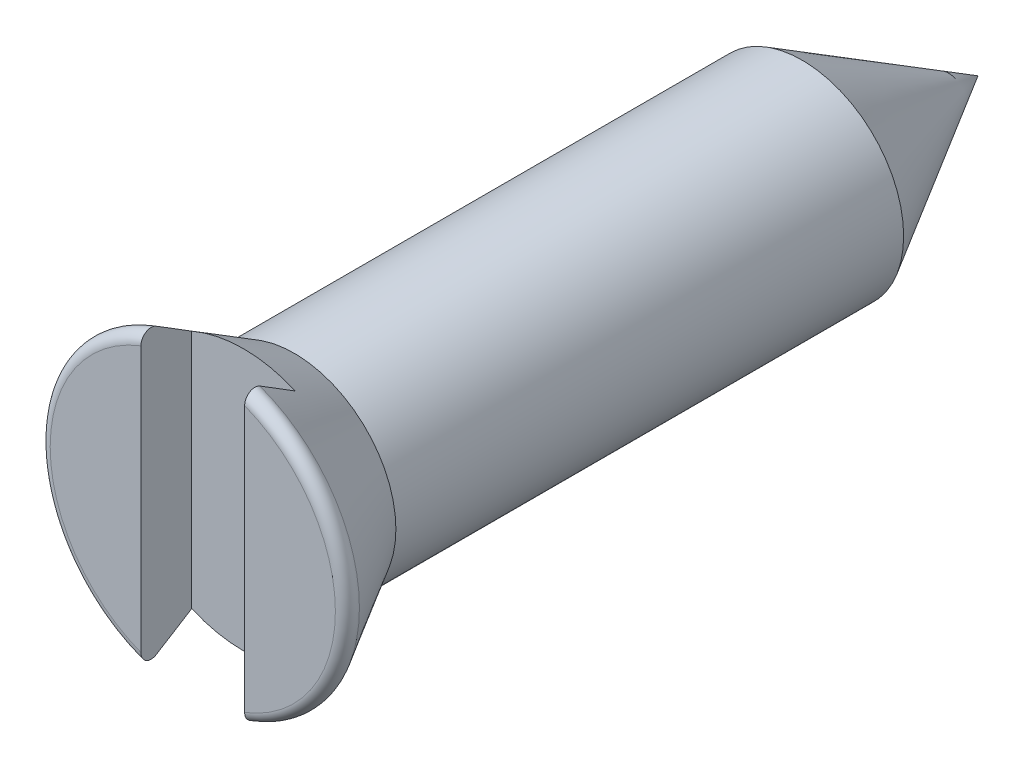
ISO-10303-21;
HEADER;
FILE_DESCRIPTION(('STEP AP214'),'2;1');
FILE_NAME('part.step','',(''),(''),'','','');
FILE_SCHEMA(('AUTOMOTIVE_DESIGN { 1 0 10303 214 1 1 1 1 }'));
ENDSEC;
DATA;
#1=APPLICATION_CONTEXT('core data for automotive mechanical design processes');
#2=APPLICATION_PROTOCOL_DEFINITION('international standard','automotive_design',2000,#1);
#3=PRODUCT_CONTEXT('',#1,'mechanical');
#4=PRODUCT('Part','Part','',(#3));
#5=PRODUCT_RELATED_PRODUCT_CATEGORY('part','',(#4));
#6=PRODUCT_DEFINITION_FORMATION('','',#4);
#7=PRODUCT_DEFINITION_CONTEXT('part definition',#1,'design');
#8=PRODUCT_DEFINITION('design','',#6,#7);
#9=PRODUCT_DEFINITION_SHAPE('','',#8);
#10=(LENGTH_UNIT() NAMED_UNIT(*) SI_UNIT(.MILLI.,.METRE.));
#11=(NAMED_UNIT(*) PLANE_ANGLE_UNIT() SI_UNIT($,.RADIAN.));
#12=(NAMED_UNIT(*) SI_UNIT($,.STERADIAN.) SOLID_ANGLE_UNIT());
#13=UNCERTAINTY_MEASURE_WITH_UNIT(LENGTH_MEASURE(1.E-05),#10,'distance_accuracy_value','');
#14=(GEOMETRIC_REPRESENTATION_CONTEXT(3) GLOBAL_UNCERTAINTY_ASSIGNED_CONTEXT((#13)) GLOBAL_UNIT_ASSIGNED_CONTEXT((#10,
#11,#12)) REPRESENTATION_CONTEXT('',''));
#15=CARTESIAN_POINT('',(0.,0.,0.));
#16=DIRECTION('',(0.,0.,1.));
#17=DIRECTION('',(1.,0.,0.));
#18=AXIS2_PLACEMENT_3D('',#15,#16,#17);
#19=CARTESIAN_POINT('',(0.,0.,5.99999999999999));
#20=DIRECTION('',(0.,0.,1.));
#21=DIRECTION('',(1.,0.,0.));
#22=AXIS2_PLACEMENT_3D('',#19,#20,#21);
#23=PLANE('',#22);
#24=DIRECTION('',(0.,1.,0.));
#25=VECTOR('',#24,1.);
#26=CARTESIAN_POINT('',(0.510620476138833,-1.49241435300667,5.99999999999999));
#27=LINE('',#26,#25);
#28=CARTESIAN_POINT('',(0.510620476138833,-1.30801010682125,5.99999999999999));
#29=VERTEX_POINT('',#28);
#30=CARTESIAN_POINT('',(0.510620476138833,1.30801010682125,5.99999999999999));
#31=VERTEX_POINT('',#30);
#32=EDGE_CURVE('E134',#29,#31,#27,.T.);
#33=ORIENTED_EDGE('',*,*,#32,.F.);
#34=CARTESIAN_POINT('',(0.,0.,5.99999999999999));
#35=DIRECTION('',(0.,0.,1.));
#36=DIRECTION('',(1.,0.,0.));
#37=AXIS2_PLACEMENT_3D('',#34,#35,#36);
#38=CIRCLE('',#37,1.40414518843273);
#39=EDGE_CURVE('E226',#29,#31,#38,.T.);
#40=ORIENTED_EDGE('',*,*,#39,.T.);
#41=EDGE_LOOP('',(#33,#40));
#42=FACE_BOUND('',#41,.T.);
#43=ADVANCED_FACE('F39',(#42),#23,.T.);
#44=CARTESIAN_POINT('',(0.,0.,5.));
#45=DIRECTION('',(0.,0.,-1.));
#46=DIRECTION('',(-1.,0.,0.));
#47=AXIS2_PLACEMENT_3D('',#44,#45,#46);
#48=CYLINDRICAL_SURFACE('',#47,1.);
#49=CARTESIAN_POINT('',(0.,0.,5.));
#50=DIRECTION('',(0.,0.,1.));
#51=DIRECTION('',(1.,0.,0.));
#52=AXIS2_PLACEMENT_3D('',#49,#50,#51);
#53=CIRCLE('',#52,1.);
#54=CARTESIAN_POINT('',(1.,0.,5.));
#55=VERTEX_POINT('',#54);
#56=EDGE_CURVE('E214',#55,#55,#53,.T.);
#57=ORIENTED_EDGE('',*,*,#56,.F.);
#58=EDGE_LOOP('',(#57));
#59=FACE_BOUND('',#58,.T.);
#60=CARTESIAN_POINT('',(0.,0.,0.));
#61=DIRECTION('',(0.,0.,1.));
#62=DIRECTION('',(1.,0.,0.));
#63=AXIS2_PLACEMENT_3D('',#60,#61,#62);
#64=CIRCLE('',#63,1.);
#65=CARTESIAN_POINT('',(1.,0.,0.));
#66=VERTEX_POINT('',#65);
#67=EDGE_CURVE('E217',#66,#66,#64,.T.);
#68=ORIENTED_EDGE('',*,*,#67,.T.);
#69=EDGE_LOOP('',(#68));
#70=FACE_BOUND('',#69,.T.);
#71=ADVANCED_FACE('F187',(#59,#70),#48,.T.);
#72=CARTESIAN_POINT('',(0.,0.,0.));
#73=DIRECTION('',(0.,0.,1.));
#74=DIRECTION('',(1.,0.,0.));
#75=AXIS2_PLACEMENT_3D('',#72,#73,#74);
#76=CONICAL_SURFACE('',#75,1.,0.5235987755983);
#77=CARTESIAN_POINT('',(0.,0.,-1.73205080756887));
#78=VERTEX_POINT('',#77);
#79=VERTEX_LOOP('',#78);
#80=FACE_BOUND('',#79,.T.);
#81=ORIENTED_EDGE('',*,*,#67,.F.);
#82=EDGE_LOOP('',(#81));
#83=FACE_BOUND('',#82,.T.);
#84=ADVANCED_FACE('F190',(#80,#83),#76,.T.);
#85=CARTESIAN_POINT('',(0.,0.,5.));
#86=DIRECTION('',(0.,0.,1.));
#87=DIRECTION('',(1.,0.,0.));
#88=AXIS2_PLACEMENT_3D('',#85,#86,#87);
#89=CONICAL_SURFACE('',#88,1.,0.5235987755983);
#90=CARTESIAN_POINT('',(-0.510620476138839,2.57572159850968,7.81605045241254));
#91=CARTESIAN_POINT('',(-0.510620476138839,2.5034979438429,7.69335233906957));
#92=CARTESIAN_POINT('',(-0.510620476138839,2.43119633814641,7.5706999564356));
#93=CARTESIAN_POINT('',(-0.510620476138839,2.28636656515141,7.32552129792128));
#94=CARTESIAN_POINT('',(-0.510620476138839,2.21383838738898,7.20299502822338));
#95=CARTESIAN_POINT('',(-0.510620476138839,2.06835790538867,6.95788955493391));
#96=CARTESIAN_POINT('',(-0.510620476138839,1.99540506642551,6.8353106684754));
#97=CARTESIAN_POINT('',(-0.510620476138839,1.84910103434979,6.59039763558222));
#98=CARTESIAN_POINT('',(-0.510620476138839,1.77574985782723,6.46806347924101));
#99=CARTESIAN_POINT('',(-0.510620476138839,1.62497597607226,6.21792463689314));
#100=CARTESIAN_POINT('',(-0.510620476138839,1.54752559601406,6.09013659303197));
#101=CARTESIAN_POINT('',(-0.510620476138839,1.39166129346604,5.83512705601668));
#102=CARTESIAN_POINT('',(-0.510620476138839,1.31324725039086,5.70790563653593));
#103=CARTESIAN_POINT('',(-0.510620476138839,1.15496581042367,5.45454941081888));
#104=CARTESIAN_POINT('',(-0.510620476138838,1.07510004793244,5.32841359282557));
#105=CARTESIAN_POINT('',(-0.510620476138838,0.953177285371248,5.14060405509319));
#106=CARTESIAN_POINT('',(-0.510620476138838,0.912186635710702,5.07823953327371));
#107=CARTESIAN_POINT('',(-0.510620476138838,0.829174451924031,4.95420208113852));
#108=CARTESIAN_POINT('',(-0.510620476138838,0.787152992721917,4.89252910103035));
#109=CARTESIAN_POINT('',(-0.510620476138838,0.71473401408326,4.78909967861266));
#110=CARTESIAN_POINT('',(-0.510620476138838,0.684742684002507,4.7470595377968));
#111=CARTESIAN_POINT('',(-0.510620476138838,0.623701761149009,4.66370925060968));
#112=CARTESIAN_POINT('',(-0.510620476138838,0.592651544456822,4.62239955718532));
#113=CARTESIAN_POINT('',(-0.510620476138838,0.529110956920073,4.54101715932744));
#114=CARTESIAN_POINT('',(-0.510620476138838,0.496623267892172,4.50094236991849));
#115=CARTESIAN_POINT('',(-0.510620476138838,0.429416871613894,4.42272701134252));
#116=CARTESIAN_POINT('',(-0.510620476138838,0.394700779174009,4.38458426588876));
#117=CARTESIAN_POINT('',(-0.510620476138838,0.330638827775282,4.32087279136503));
#118=CARTESIAN_POINT('',(-0.510620476138838,0.302078426966531,4.29452209639064));
#119=CARTESIAN_POINT('',(-0.510620476138838,0.241942660473876,4.24554100761783));
#120=CARTESIAN_POINT('',(-0.510620476138838,0.210381983517794,4.22289382954547));
#121=CARTESIAN_POINT('',(-0.510620476138838,0.159814945483697,4.19426963674259));
#122=CARTESIAN_POINT('',(-0.510620476138838,0.142365002944414,4.18560165180536));
#123=CARTESIAN_POINT('',(-0.510620476138838,0.106392084690999,4.17085695184258));
#124=CARTESIAN_POINT('',(-0.510620476138838,0.0878705490409794,4.16477684692445));
#125=CARTESIAN_POINT('',(-0.510620476138838,0.0497528382263139,4.15595202004334));
#126=CARTESIAN_POINT('',(-0.510620476138838,0.030145692459297,4.15325245951685));
#127=CARTESIAN_POINT('',(-0.510620476138838,-0.00921253431688717,4.15185869840978));
#128=CARTESIAN_POINT('',(-0.510620476138838,-0.0289635556081685,4.15316292104906));
#129=CARTESIAN_POINT('',(-0.510620476138838,-0.065146915942581,4.15906619618197));
#130=CARTESIAN_POINT('',(-0.510620476138838,-0.081662306297202,4.16318781158434));
#131=CARTESIAN_POINT('',(-0.510620476138838,-0.113935285019395,4.17370321609888));
#132=CARTESIAN_POINT('',(-0.510620476138838,-0.129692631664225,4.18009772460297));
#133=CARTESIAN_POINT('',(-0.510620476138838,-0.174824141999773,4.20144307992216));
#134=CARTESIAN_POINT('',(-0.510620476138838,-0.203055669926148,4.21878252482136));
#135=CARTESIAN_POINT('',(-0.510620476138838,-0.243427655657711,4.24750073435898));
#136=CARTESIAN_POINT('',(-0.510620476138838,-0.256594857034518,4.25756171185834));
#137=CARTESIAN_POINT('',(-0.510620476138838,-0.282358284858162,4.27838935009008));
#138=CARTESIAN_POINT('',(-0.510620476138838,-0.294954775997102,4.28915567789858));
#139=CARTESIAN_POINT('',(-0.510620476138838,-0.331569784983721,4.32185190648242));
#140=CARTESIAN_POINT('',(-0.510620476138838,-0.354901313889681,4.3445443864609));
#141=CARTESIAN_POINT('',(-0.510620476138838,-0.400230315746037,4.39123367698336));
#142=CARTESIAN_POINT('',(-0.510620476138838,-0.422226742277695,4.41523148337543));
#143=CARTESIAN_POINT('',(-0.510620476138838,-0.48685008888734,4.4886236632232));
#144=CARTESIAN_POINT('',(-0.510620476138838,-0.528000371981175,4.53930964982441));
#145=CARTESIAN_POINT('',(-0.510620476138838,-0.608355352873132,4.64285270093221));
#146=CARTESIAN_POINT('',(-0.510620476138838,-0.647540240636435,4.69572470486778));
#147=CARTESIAN_POINT('',(-0.510620476138838,-0.72435533809418,4.80245180248451));
#148=CARTESIAN_POINT('',(-0.510620476138838,-0.761987999149996,4.85630513594965));
#149=CARTESIAN_POINT('',(-0.510620476138838,-0.840691849917638,4.97117812152204));
#150=CARTESIAN_POINT('',(-0.510620476138838,-0.881635796207054,5.03228434563951));
#151=CARTESIAN_POINT('',(-0.510620476138838,-0.962662260302334,5.15506651860361));
#152=CARTESIAN_POINT('',(-0.510620476138838,-1.00274474720208,5.21674248777755));
#153=CARTESIAN_POINT('',(-0.510620476138838,-1.12209456101005,5.402372578289));
#154=CARTESIAN_POINT('',(-0.510620476138838,-1.20045188627412,5.52691046982221));
#155=CARTESIAN_POINT('',(-0.510620476138838,-1.3559119368108,5.77698407542893));
#156=CARTESIAN_POINT('',(-0.510620476138838,-1.43301290876407,5.90252087153406));
#157=CARTESIAN_POINT('',(-0.510620476138838,-1.58634951734865,6.15410641657793));
#158=CARTESIAN_POINT('',(-0.510620476138838,-1.66258522911062,6.28015511975709));
#159=CARTESIAN_POINT('',(-0.510620476138838,-1.80904258725174,6.52354908499605));
#160=CARTESIAN_POINT('',(-0.510620476138838,-1.87930367068633,6.64087066326468));
#161=CARTESIAN_POINT('',(-0.510620476138838,-2.01947330177345,6.87572860974595));
#162=CARTESIAN_POINT('',(-0.510620476138838,-2.08938183948825,6.99326498388754));
#163=CARTESIAN_POINT('',(-0.510620476138838,-2.22880971027039,7.22827807365261));
#164=CARTESIAN_POINT('',(-0.510620476138838,-2.29832952101758,7.34575450607487));
#165=CARTESIAN_POINT('',(-0.510620476138838,-2.43716418516349,7.58082330113592));
#166=CARTESIAN_POINT('',(-0.510620476138838,-2.5064790451378,7.69841565989033));
#167=CARTESIAN_POINT('',(-0.510620476138838,-2.57572159850971,7.81605045241258));
#168=B_SPLINE_CURVE_WITH_KNOTS('',3,(#90,#91,#92,#93,#94,#95,#96,#97,#98,#99,#100,#101,#102,
#103,#104,#105,#106,#107,#108,#109,#110,#111,#112,#113,#114,#115,#116,#117,#118,#119,#120,#121,
#122,#123,#124,#125,#126,#127,#128,#129,#130,#131,#132,#133,#134,#135,#136,#137,#138,#139,#140,
#141,#142,#143,#144,#145,#146,#147,#148,#149,#150,#151,#152,#153,#154,#155,#156,#157,#158,#159,
#160,#161,#162,#163,#164,#165,#166,#167),.UNSPECIFIED.,.F.,.F.,(4,2,2,2,2,2,2,2,2,2,2,2,2,2,2,2,
2,2,2,2,2,2,2,2,2,2,2,2,2,2,2,2,2,2,2,2,2,2,4),(0.,0.427129829128884,0.854279685218111,
1.28221518191857,1.7101329905576,2.15840994849375,2.60674358337357,3.05460039601161,
3.27848311718548,3.50234961346322,3.65726461515391,3.81227252928039,3.96700253434762,
4.12155418557135,4.23801158128614,4.35392561882697,4.41222950329156,4.47045677804034,
4.52945390169422,4.58842779393103,4.63929697252175,4.69018226604124,4.7889608650811,
4.83867063494928,4.88835710863173,4.98591024614293,5.08353888138617,5.27925672548692,
5.47666028926448,5.67373913093117,5.89439525501968,6.11505928229955,6.55645384337939,
6.99841916395794,7.44034581044086,7.8505996191643,8.26086492839659,8.67038082796646,
9.07988344296214),.UNSPECIFIED.);
#169=CARTESIAN_POINT('',(-0.510620476138838,-1.18319496781836,5.49999999999999));
#170=VERTEX_POINT('',#169);
#171=CARTESIAN_POINT('',(-0.510620476138838,-1.400569712761,5.84999999999999));
#172=VERTEX_POINT('',#171);
#173=EDGE_CURVE('E116',#170,#172,#168,.T.);
#174=ORIENTED_EDGE('',*,*,#173,.T.);
#175=CARTESIAN_POINT('',(0.,0.,5.84999999999999));
#176=DIRECTION('',(0.,0.,1.));
#177=DIRECTION('',(1.,0.,0.));
#178=AXIS2_PLACEMENT_3D('',#175,#176,#177);
#179=CIRCLE('',#178,1.49074772881118);
#180=CARTESIAN_POINT('',(-0.510620476138839,1.400569712761,5.84999999999999));
#181=VERTEX_POINT('',#180);
#182=EDGE_CURVE('E110',#172,#181,#179,.F.);
#183=ORIENTED_EDGE('',*,*,#182,.T.);
#184=CARTESIAN_POINT('',(-0.510620476138839,1.18319496781836,5.49999999999999));
#185=VERTEX_POINT('',#184);
#186=EDGE_CURVE('E102',#181,#185,#168,.T.);
#187=ORIENTED_EDGE('',*,*,#186,.T.);
#188=CARTESIAN_POINT('',(0.,0.,5.49999999999999));
#189=DIRECTION('',(0.,0.,-1.));
#190=DIRECTION('',(-1.,0.,0.));
#191=AXIS2_PLACEMENT_3D('',#188,#189,#190);
#192=CIRCLE('',#191,1.28867513459481);
#193=CARTESIAN_POINT('',(0.510620476138833,1.18319496781836,5.49999999999999));
#194=VERTEX_POINT('',#193);
#195=EDGE_CURVE('E108',#185,#194,#192,.T.);
#196=ORIENTED_EDGE('',*,*,#195,.T.);
#197=CARTESIAN_POINT('',(0.510620476138833,-2.57572159850969,7.81605045241254));
#198=CARTESIAN_POINT('',(0.510620476138833,-2.5034979438429,7.69335233906957));
#199=CARTESIAN_POINT('',(0.510620476138833,-2.43119633814642,7.5706999564356));
#200=CARTESIAN_POINT('',(0.510620476138833,-2.28636656515141,7.32552129792128));
#201=CARTESIAN_POINT('',(0.510620476138833,-2.21383838738898,7.20299502822338));
#202=CARTESIAN_POINT('',(0.510620476138833,-2.06835790538868,6.95788955493392));
#203=CARTESIAN_POINT('',(0.510620476138833,-1.99540506642551,6.83531066847541));
#204=CARTESIAN_POINT('',(0.510620476138833,-1.84910103434979,6.59039763558222));
#205=CARTESIAN_POINT('',(0.510620476138833,-1.77574985782723,6.46806347924101));
#206=CARTESIAN_POINT('',(0.510620476138833,-1.62497597607226,6.21792463689315));
#207=CARTESIAN_POINT('',(0.510620476138833,-1.54752559601406,6.09013659303197));
#208=CARTESIAN_POINT('',(0.510620476138833,-1.39166129346605,5.83512705601668));
#209=CARTESIAN_POINT('',(0.510620476138833,-1.31324725039086,5.70790563653593));
#210=CARTESIAN_POINT('',(0.510620476138833,-1.15496581042367,5.45454941081888));
#211=CARTESIAN_POINT('',(0.510620476138833,-1.07510004793244,5.32841359282557));
#212=CARTESIAN_POINT('',(0.510620476138833,-0.953177285371251,5.14060405509319));
#213=CARTESIAN_POINT('',(0.510620476138833,-0.912186635710705,5.07823953327371));
#214=CARTESIAN_POINT('',(0.510620476138833,-0.829174451924034,4.95420208113852));
#215=CARTESIAN_POINT('',(0.510620476138833,-0.78715299272192,4.89252910103035));
#216=CARTESIAN_POINT('',(0.510620476138833,-0.714734014083262,4.78909967861265));
#217=CARTESIAN_POINT('',(0.510620476138833,-0.684742684002507,4.74705953779679));
#218=CARTESIAN_POINT('',(0.510620476138833,-0.623701761149008,4.66370925060967));
#219=CARTESIAN_POINT('',(0.510620476138833,-0.59265154445682,4.62239955718531));
#220=CARTESIAN_POINT('',(0.510620476138833,-0.529110956920069,4.54101715932743));
#221=CARTESIAN_POINT('',(0.510620476138833,-0.496623267892167,4.50094236991848));
#222=CARTESIAN_POINT('',(0.510620476138833,-0.429416871613887,4.42272701134251));
#223=CARTESIAN_POINT('',(0.510620476138833,-0.394700779174001,4.38458426588875));
#224=CARTESIAN_POINT('',(0.510620476138833,-0.330638827775275,4.32087279136502));
#225=CARTESIAN_POINT('',(0.510620476138833,-0.302078426966526,4.29452209639063));
#226=CARTESIAN_POINT('',(0.510620476138833,-0.241942660473877,4.24554100761782));
#227=CARTESIAN_POINT('',(0.510620476138833,-0.210381983517798,4.22289382954546));
#228=CARTESIAN_POINT('',(0.510620476138833,-0.159814945483703,4.19426963674258));
#229=CARTESIAN_POINT('',(0.510620476138833,-0.142365002944419,4.18560165180535));
#230=CARTESIAN_POINT('',(0.510620476138833,-0.106392084691005,4.17085695184257));
#231=CARTESIAN_POINT('',(0.510620476138833,-0.087870549040985,4.16477684692444));
#232=CARTESIAN_POINT('',(0.510620476138833,-0.0497528382263194,4.15595202004333));
#233=CARTESIAN_POINT('',(0.510620476138833,-0.0301456924593023,4.15325245951684));
#234=CARTESIAN_POINT('',(0.510620476138833,0.00921253431688235,4.15185869840977));
#235=CARTESIAN_POINT('',(0.510620476138833,0.028963555608164,4.15316292104905));
#236=CARTESIAN_POINT('',(0.510620476138833,0.0651469159425763,4.15906619618196));
#237=CARTESIAN_POINT('',(0.510620476138833,0.081662306297197,4.16318781158433));
#238=CARTESIAN_POINT('',(0.510620476138833,0.11393528501939,4.17370321609887));
#239=CARTESIAN_POINT('',(0.510620476138833,0.12969263166422,4.18009772460295));
#240=CARTESIAN_POINT('',(0.510620476138833,0.174824141999768,4.20144307992215));
#241=CARTESIAN_POINT('',(0.510620476138833,0.203055669926142,4.21878252482135));
#242=CARTESIAN_POINT('',(0.510620476138833,0.243427655657703,4.24750073435897));
#243=CARTESIAN_POINT('',(0.510620476138833,0.256594857034511,4.25756171185833));
#244=CARTESIAN_POINT('',(0.510620476138833,0.282358284858154,4.27838935009007));
#245=CARTESIAN_POINT('',(0.510620476138833,0.294954775997094,4.28915567789857));
#246=CARTESIAN_POINT('',(0.510620476138833,0.331569784983712,4.3218519064824));
#247=CARTESIAN_POINT('',(0.510620476138833,0.354901313889671,4.34454438646089));
#248=CARTESIAN_POINT('',(0.510620476138833,0.400230315746025,4.39123367698334));
#249=CARTESIAN_POINT('',(0.510620476138833,0.422226742277682,4.41523148337541));
#250=CARTESIAN_POINT('',(0.510620476138833,0.486850088887324,4.48862366322317));
#251=CARTESIAN_POINT('',(0.510620476138833,0.528000371981157,4.53930964982438));
#252=CARTESIAN_POINT('',(0.510620476138833,0.608355352873111,4.64285270093218));
#253=CARTESIAN_POINT('',(0.510620476138833,0.647540240636412,4.69572470486774));
#254=CARTESIAN_POINT('',(0.510620476138833,0.724355338094154,4.80245180248447));
#255=CARTESIAN_POINT('',(0.510620476138833,0.761987999149969,4.8563051359496));
#256=CARTESIAN_POINT('',(0.510620476138833,0.840691849917611,4.97117812152199));
#257=CARTESIAN_POINT('',(0.510620476138833,0.881635796207026,5.03228434563946));
#258=CARTESIAN_POINT('',(0.510620476138833,0.962662260302307,5.15506651860356));
#259=CARTESIAN_POINT('',(0.510620476138833,1.00274474720206,5.21674248777751));
#260=CARTESIAN_POINT('',(0.510620476138833,1.12209456101003,5.40237257828896));
#261=CARTESIAN_POINT('',(0.510620476138833,1.2004518862741,5.52691046982217));
#262=CARTESIAN_POINT('',(0.510620476138833,1.35591193681078,5.7769840754289));
#263=CARTESIAN_POINT('',(0.510620476138833,1.43301290876405,5.90252087153402));
#264=CARTESIAN_POINT('',(0.510620476138833,1.58634951734863,6.1541064165779));
#265=CARTESIAN_POINT('',(0.510620476138833,1.6625852291106,6.28015511975706));
#266=CARTESIAN_POINT('',(0.510620476138833,1.80904258725172,6.52354908499602));
#267=CARTESIAN_POINT('',(0.510620476138833,1.87930367068632,6.64087066326465));
#268=CARTESIAN_POINT('',(0.510620476138833,2.01947330177344,6.87572860974592));
#269=CARTESIAN_POINT('',(0.510620476138833,2.08938183948823,6.9932649838875));
#270=CARTESIAN_POINT('',(0.510620476138833,2.22880971027037,7.22827807365257));
#271=CARTESIAN_POINT('',(0.510620476138833,2.29832952101756,7.34575450607484));
#272=CARTESIAN_POINT('',(0.510620476138833,2.43716418516347,7.58082330113588));
#273=CARTESIAN_POINT('',(0.510620476138833,2.50647904513778,7.69841565989029));
#274=CARTESIAN_POINT('',(0.510620476138833,2.57572159850969,7.81605045241254));
#275=B_SPLINE_CURVE_WITH_KNOTS('',3,(#197,#198,#199,#200,#201,#202,#203,#204,#205,#206,#207,
#208,#209,#210,#211,#212,#213,#214,#215,#216,#217,#218,#219,#220,#221,#222,#223,#224,#225,#226,
#227,#228,#229,#230,#231,#232,#233,#234,#235,#236,#237,#238,#239,#240,#241,#242,#243,#244,#245,
#246,#247,#248,#249,#250,#251,#252,#253,#254,#255,#256,#257,#258,#259,#260,#261,#262,#263,#264,
#265,#266,#267,#268,#269,#270,#271,#272,#273,#274),.UNSPECIFIED.,.F.,.F.,(4,2,2,2,2,2,2,2,2,2,2,
2,2,2,2,2,2,2,2,2,2,2,2,2,2,2,2,2,2,2,2,2,2,2,2,2,2,2,4),(0.,0.427129829128885,0.85427968521811,
1.28221518191857,1.7101329905576,2.15840994849375,2.60674358337357,3.05460039601161,
3.27848311718548,3.50234961346322,3.65726461515392,3.8122725292804,3.96700253434764,
4.12155418557137,4.23801158128615,4.35392561882697,4.41222950329156,4.47045677804034,
4.52945390169422,4.58842779393104,4.63929697252175,4.69018226604124,4.78896086508111,
4.83867063494928,4.88835710863173,4.98591024614293,5.08353888138616,5.2792567254869,
5.47666028926445,5.67373913093113,5.89439525501965,6.11505928229952,6.55645384337937,
6.99841916395792,7.44034581044084,7.85059961916428,8.26086492839657,8.67038082796644,
9.07988344296212),.UNSPECIFIED.);
#276=CARTESIAN_POINT('',(0.510620476138833,1.400569712761,5.84999999999999));
#277=VERTEX_POINT('',#276);
#278=EDGE_CURVE('E115',#194,#277,#275,.T.);
#279=ORIENTED_EDGE('',*,*,#278,.T.);
#280=CARTESIAN_POINT('',(0.,0.,5.84999999999999));
#281=DIRECTION('',(0.,0.,1.));
#282=DIRECTION('',(1.,0.,0.));
#283=AXIS2_PLACEMENT_3D('',#280,#281,#282);
#284=CIRCLE('',#283,1.49074772881118);
#285=CARTESIAN_POINT('',(0.510620476138833,-1.400569712761,5.84999999999999));
#286=VERTEX_POINT('',#285);
#287=EDGE_CURVE('E223',#277,#286,#284,.F.);
#288=ORIENTED_EDGE('',*,*,#287,.T.);
#289=CARTESIAN_POINT('',(0.510620476138833,-1.18319496781836,5.49999999999999));
#290=VERTEX_POINT('',#289);
#291=EDGE_CURVE('E221',#286,#290,#275,.T.);
#292=ORIENTED_EDGE('',*,*,#291,.T.);
#293=EDGE_CURVE('E129',#290,#170,#192,.T.);
#294=ORIENTED_EDGE('',*,*,#293,.T.);
#295=EDGE_LOOP('',(#174,#183,#187,#196,#279,#288,#292,#294));
#296=FACE_BOUND('',#295,.T.);
#297=ORIENTED_EDGE('',*,*,#56,.T.);
#298=EDGE_LOOP('',(#297));
#299=FACE_BOUND('',#298,.T.);
#300=ADVANCED_FACE('F105',(#296,#299),#89,.T.);
#301=DIRECTION('',(0.,-1.,0.));
#302=VECTOR('',#301,1.);
#303=CARTESIAN_POINT('',(-0.510620476138839,1.49241435300667,5.99999999999999));
#304=LINE('',#303,#302);
#305=CARTESIAN_POINT('',(-0.510620476138839,1.30801010682125,5.99999999999999));
#306=VERTEX_POINT('',#305);
#307=CARTESIAN_POINT('',(-0.510620476138838,-1.30801010682125,5.99999999999999));
#308=VERTEX_POINT('',#307);
#309=EDGE_CURVE('E139',#306,#308,#304,.T.);
#310=ORIENTED_EDGE('',*,*,#309,.F.);
#311=CARTESIAN_POINT('',(0.,0.,5.99999999999999));
#312=DIRECTION('',(0.,0.,1.));
#313=DIRECTION('',(1.,0.,0.));
#314=AXIS2_PLACEMENT_3D('',#311,#312,#313);
#315=CIRCLE('',#314,1.40414518843273);
#316=EDGE_CURVE('E128',#306,#308,#315,.T.);
#317=ORIENTED_EDGE('',*,*,#316,.T.);
#318=EDGE_LOOP('',(#310,#317));
#319=FACE_BOUND('',#318,.T.);
#320=ADVANCED_FACE('F165',(#319),#23,.T.);
#321=CARTESIAN_POINT('',(0.,0.,5.49999999999999));
#322=DIRECTION('',(0.,0.,-1.));
#323=DIRECTION('',(-1.,0.,0.));
#324=AXIS2_PLACEMENT_3D('',#321,#322,#323);
#325=PLANE('',#324);
#326=DIRECTION('',(0.,-1.,0.));
#327=VECTOR('',#326,1.);
#328=CARTESIAN_POINT('',(-0.510620476138839,1.49241435300667,5.49999999999999));
#329=LINE('',#328,#327);
#330=EDGE_CURVE('E123',#185,#170,#329,.T.);
#331=ORIENTED_EDGE('',*,*,#330,.T.);
#332=ORIENTED_EDGE('',*,*,#293,.F.);
#333=DIRECTION('',(0.,1.,0.));
#334=VECTOR('',#333,1.);
#335=CARTESIAN_POINT('',(0.510620476138833,-1.49241435300667,5.49999999999999));
#336=LINE('',#335,#334);
#337=EDGE_CURVE('E126',#290,#194,#336,.T.);
#338=ORIENTED_EDGE('',*,*,#337,.T.);
#339=ORIENTED_EDGE('',*,*,#195,.F.);
#340=EDGE_LOOP('',(#331,#332,#338,#339));
#341=FACE_BOUND('',#340,.T.);
#342=ADVANCED_FACE('F121',(#341),#325,.F.);
#343=CARTESIAN_POINT('',(0.510620476138833,-1.49241435300667,5.49999999999999));
#344=DIRECTION('',(1.,0.,0.));
#345=DIRECTION('',(0.,0.,-1.));
#346=AXIS2_PLACEMENT_3D('',#343,#344,#345);
#347=PLANE('',#346);
#348=ORIENTED_EDGE('',*,*,#32,.T.);
#349=CARTESIAN_POINT('',(0.510620476138833,1.30801010682125,5.99999999999999));
#350=CARTESIAN_POINT('',(0.510620476138833,1.31434597249689,6.00000349189739));
#351=CARTESIAN_POINT('',(0.510620476138833,1.32068391090495,5.99947757950159));
#352=CARTESIAN_POINT('',(0.510620476138833,1.33319557381214,5.99738244724328));
#353=CARTESIAN_POINT('',(0.510620476138833,1.33936900381489,5.9958114720172));
#354=CARTESIAN_POINT('',(0.510620476138833,1.35136915180521,5.99163889390963));
#355=CARTESIAN_POINT('',(0.510620476138833,1.35719537155114,5.98903584912853));
#356=CARTESIAN_POINT('',(0.510620476138833,1.3682981682992,5.98285027032505));
#357=CARTESIAN_POINT('',(0.510620476138833,1.3735752425921,5.97926863333689));
#358=CARTESIAN_POINT('',(0.510620476138833,1.38319516862383,5.97137070004296));
#359=CARTESIAN_POINT('',(0.510620476138833,1.38756717966386,5.96708998979739));
#360=CARTESIAN_POINT('',(0.510620476138833,1.39547068454689,5.95780996278737));
#361=CARTESIAN_POINT('',(0.510620476138833,1.39900230567385,5.9528107550295));
#362=CARTESIAN_POINT('',(0.510620476138833,1.40488121012416,5.94258510857221));
#363=CARTESIAN_POINT('',(0.510620476138833,1.40729018915883,5.93739412224778));
#364=CARTESIAN_POINT('',(0.510620476138833,1.41114730195772,5.92666771676596));
#365=CARTESIAN_POINT('',(0.510620476138833,1.41259593704037,5.92113247896795));
#366=CARTESIAN_POINT('',(0.510620476138833,1.41442384533629,5.91018549304364));
#367=CARTESIAN_POINT('',(0.510620476138833,1.41485491119133,5.90478234147868));
#368=CARTESIAN_POINT('',(0.510620476138833,1.41478373327197,5.89397973475507));
#369=CARTESIAN_POINT('',(0.510620476138833,1.41428117419827,5.88858028146145));
#370=CARTESIAN_POINT('',(0.510620476138833,1.41238065015698,5.87804863404385));
#371=CARTESIAN_POINT('',(0.510620476138833,1.41099979633597,5.87291331687667));
#372=CARTESIAN_POINT('',(0.510620476138833,1.40741061048746,5.86294958103915));
#373=CARTESIAN_POINT('',(0.510620476138833,1.40520395069215,5.85812056507415));
#374=CARTESIAN_POINT('',(0.510620476138833,1.40196471740801,5.8523232194572));
#375=CARTESIAN_POINT('',(0.510620476138833,1.40127907094168,5.85115396847178));
#376=CARTESIAN_POINT('',(0.510620476138833,1.400569712761,5.84999999999999));
#377=B_SPLINE_CURVE_WITH_KNOTS('',3,(#349,#350,#351,#352,#353,#354,#355,#356,#357,#358,#359,
#360,#361,#362,#363,#364,#365,#366,#367,#368,#369,#370,#371,#372,#373,#374,#375,#376),
.UNSPECIFIED.,.F.,.F.,(4,2,2,2,2,2,2,2,2,2,2,2,2,4),(0.,0.018989312174054,0.0380106009863982,
0.0570585585270059,0.0760891138500543,0.0943497196000641,0.112607557868142,0.129687806910895,
0.146759132691975,0.162940836481172,0.179128006070869,0.195009088463121,0.210858184638194,
0.214923208862805),.UNSPECIFIED.);
#378=EDGE_CURVE('E11',#31,#277,#377,.T.);
#379=ORIENTED_EDGE('',*,*,#378,.T.);
#380=ORIENTED_EDGE('',*,*,#278,.F.);
#381=ORIENTED_EDGE('',*,*,#337,.F.);
#382=ORIENTED_EDGE('',*,*,#291,.F.);
#383=CARTESIAN_POINT('',(0.510620476138833,-1.400569712761,5.84999999999999));
#384=CARTESIAN_POINT('',(0.510620476138833,-1.40338771014396,5.85457465543379));
#385=CARTESIAN_POINT('',(0.510620476138833,-1.40582238579815,5.8593869188659));
#386=CARTESIAN_POINT('',(0.510620476138833,-1.40985991874919,5.86934797904649));
#387=CARTESIAN_POINT('',(0.510620476138833,-1.41146283018337,5.87449675386777));
#388=CARTESIAN_POINT('',(0.510620476138833,-1.41377357563003,5.88499974924364));
#389=CARTESIAN_POINT('',(0.510620476138833,-1.41448021915926,5.89035423333525));
#390=CARTESIAN_POINT('',(0.510620476138833,-1.41496840363669,5.90110212666664));
#391=CARTESIAN_POINT('',(0.510620476138833,-1.41475047361845,5.90649551188416));
#392=CARTESIAN_POINT('',(0.510620476138833,-1.41340915385594,5.91708520281953));
#393=CARTESIAN_POINT('',(0.510620476138833,-1.41229947278921,5.92228325418637));
#394=CARTESIAN_POINT('',(0.510620476138833,-1.40923271658419,5.93242385280893));
#395=CARTESIAN_POINT('',(0.510620476138833,-1.40727540160791,5.93736632730579));
#396=CARTESIAN_POINT('',(0.510620476138833,-1.40255440267983,5.94692172324527));
#397=CARTESIAN_POINT('',(0.510620476138833,-1.39978147455919,5.95153006686104));
#398=CARTESIAN_POINT('',(0.510620476138833,-1.39353185244374,5.96024015135145));
#399=CARTESIAN_POINT('',(0.510620476138833,-1.3900551274147,5.9643418698734));
#400=CARTESIAN_POINT('',(0.510620476138833,-1.38234108414317,5.97211559311311));
#401=CARTESIAN_POINT('',(0.510620476138833,-1.37807742852423,5.97576143361686));
#402=CARTESIAN_POINT('',(0.510620476138833,-1.36902753848658,5.98233446204045));
#403=CARTESIAN_POINT('',(0.510620476138833,-1.36424107008172,5.98526132626107));
#404=CARTESIAN_POINT('',(0.510620476138833,-1.35397401234993,5.99050013722555));
#405=CARTESIAN_POINT('',(0.510620476138833,-1.34846894072688,5.99276410371597));
#406=CARTESIAN_POINT('',(0.510620476138833,-1.33717451062673,5.99638968573099));
#407=CARTESIAN_POINT('',(0.510620476138833,-1.33138530881472,5.99775179265459));
#408=CARTESIAN_POINT('',(0.510620476138833,-1.31973255041967,5.99955300592859));
#409=CARTESIAN_POINT('',(0.510620476138833,-1.31387059517242,6.00000246319983));
#410=CARTESIAN_POINT('',(0.510620476138833,-1.30801010682125,5.99999999999999));
#411=B_SPLINE_CURVE_WITH_KNOTS('',3,(#383,#384,#385,#386,#387,#388,#389,#390,#391,#392,#393,
#394,#395,#396,#397,#398,#399,#400,#401,#402,#403,#404,#405,#406,#407,#408,#409,#410),
.UNSPECIFIED.,.F.,.F.,(4,2,2,2,2,2,2,2,2,2,2,2,2,4),(0.,0.0161028890557833,0.0322047298853821,
0.0483279359400138,0.0644419176700699,0.0803128159923344,0.0961882079217499,0.112250961876476,
0.128314424279397,0.145070717214578,0.161834540438085,0.179613693830889,0.197383151852106,
0.214949923822845),.UNSPECIFIED.);
#412=EDGE_CURVE('E54',#286,#29,#411,.T.);
#413=ORIENTED_EDGE('',*,*,#412,.T.);
#414=EDGE_LOOP('',(#348,#379,#380,#381,#382,#413));
#415=FACE_BOUND('',#414,.T.);
#416=ADVANCED_FACE('F162',(#415),#347,.F.);
#417=CARTESIAN_POINT('',(-0.510620476138839,1.49241435300667,5.49999999999999));
#418=DIRECTION('',(-1.,0.,0.));
#419=DIRECTION('',(0.,-1.,0.));
#420=AXIS2_PLACEMENT_3D('',#417,#418,#419);
#421=PLANE('',#420);
#422=ORIENTED_EDGE('',*,*,#309,.T.);
#423=CARTESIAN_POINT('',(-0.510620476138838,-1.30801010682125,5.99999999999999));
#424=CARTESIAN_POINT('',(-0.510620476138838,-1.31434597249688,6.00000349189739));
#425=CARTESIAN_POINT('',(-0.510620476138838,-1.32068391090495,5.99947757950159));
#426=CARTESIAN_POINT('',(-0.510620476138838,-1.33319557381214,5.99738244724328));
#427=CARTESIAN_POINT('',(-0.510620476138838,-1.33936900381489,5.9958114720172));
#428=CARTESIAN_POINT('',(-0.510620476138838,-1.3513691518052,5.99163889390963));
#429=CARTESIAN_POINT('',(-0.510620476138838,-1.35719537155113,5.98903584912853));
#430=CARTESIAN_POINT('',(-0.510620476138838,-1.3682981682992,5.98285027032505));
#431=CARTESIAN_POINT('',(-0.510620476138838,-1.3735752425921,5.97926863333689));
#432=CARTESIAN_POINT('',(-0.510620476138838,-1.38319516862382,5.97137070004296));
#433=CARTESIAN_POINT('',(-0.510620476138838,-1.38756717966386,5.96708998979739));
#434=CARTESIAN_POINT('',(-0.510620476138838,-1.39547068454689,5.95780996278737));
#435=CARTESIAN_POINT('',(-0.510620476138838,-1.39900230567385,5.9528107550295));
#436=CARTESIAN_POINT('',(-0.510620476138838,-1.40488121012416,5.94258510857221));
#437=CARTESIAN_POINT('',(-0.510620476138838,-1.40729018915883,5.93739412224778));
#438=CARTESIAN_POINT('',(-0.510620476138838,-1.41114730195772,5.92666771676596));
#439=CARTESIAN_POINT('',(-0.510620476138838,-1.41259593704037,5.92113247896795));
#440=CARTESIAN_POINT('',(-0.510620476138838,-1.41442384533629,5.91018549304364));
#441=CARTESIAN_POINT('',(-0.510620476138838,-1.41485491119132,5.90478234147868));
#442=CARTESIAN_POINT('',(-0.510620476138838,-1.41478373327197,5.89397973475507));
#443=CARTESIAN_POINT('',(-0.510620476138838,-1.41428117419826,5.88858028146145));
#444=CARTESIAN_POINT('',(-0.510620476138838,-1.41238065015697,5.87804863404385));
#445=CARTESIAN_POINT('',(-0.510620476138838,-1.41099979633597,5.87291331687667));
#446=CARTESIAN_POINT('',(-0.510620476138838,-1.40741061048746,5.86294958103915));
#447=CARTESIAN_POINT('',(-0.510620476138838,-1.40520395069215,5.85812056507415));
#448=CARTESIAN_POINT('',(-0.510620476138838,-1.40196471740801,5.8523232194572));
#449=CARTESIAN_POINT('',(-0.510620476138838,-1.40127907094168,5.85115396847178));
#450=CARTESIAN_POINT('',(-0.510620476138838,-1.400569712761,5.84999999999999));
#451=B_SPLINE_CURVE_WITH_KNOTS('',3,(#423,#424,#425,#426,#427,#428,#429,#430,#431,#432,#433,
#434,#435,#436,#437,#438,#439,#440,#441,#442,#443,#444,#445,#446,#447,#448,#449,#450),
.UNSPECIFIED.,.F.,.F.,(4,2,2,2,2,2,2,2,2,2,2,2,2,4),(0.,0.0189893121740538,0.0380106009863982,
0.0570585585270057,0.0760891138500536,0.0943497196000641,0.112607557868142,0.129687806910896,
0.146759132691975,0.162940836481173,0.179128006070869,0.195009088463121,0.210858184638195,
0.214923208862805),.UNSPECIFIED.);
#452=EDGE_CURVE('E177',#308,#172,#451,.T.);
#453=ORIENTED_EDGE('',*,*,#452,.T.);
#454=ORIENTED_EDGE('',*,*,#173,.F.);
#455=ORIENTED_EDGE('',*,*,#330,.F.);
#456=ORIENTED_EDGE('',*,*,#186,.F.);
#457=CARTESIAN_POINT('',(-0.510620476138839,1.400569712761,5.84999999999999));
#458=CARTESIAN_POINT('',(-0.510620476138839,1.40338771014395,5.85457465543379));
#459=CARTESIAN_POINT('',(-0.510620476138839,1.40582238579815,5.8593869188659));
#460=CARTESIAN_POINT('',(-0.510620476138839,1.40985991874919,5.86934797904649));
#461=CARTESIAN_POINT('',(-0.510620476138839,1.41146283018337,5.87449675386777));
#462=CARTESIAN_POINT('',(-0.510620476138839,1.41377357563002,5.88499974924364));
#463=CARTESIAN_POINT('',(-0.510620476138839,1.41448021915926,5.89035423333525));
#464=CARTESIAN_POINT('',(-0.510620476138839,1.41496840363668,5.90110212666664));
#465=CARTESIAN_POINT('',(-0.510620476138839,1.41475047361844,5.90649551188416));
#466=CARTESIAN_POINT('',(-0.510620476138839,1.41340915385594,5.91708520281953));
#467=CARTESIAN_POINT('',(-0.510620476138839,1.41229947278921,5.92228325418637));
#468=CARTESIAN_POINT('',(-0.510620476138839,1.40923271658419,5.93242385280893));
#469=CARTESIAN_POINT('',(-0.510620476138839,1.40727540160791,5.93736632730579));
#470=CARTESIAN_POINT('',(-0.510620476138839,1.40255440267983,5.94692172324527));
#471=CARTESIAN_POINT('',(-0.510620476138839,1.39978147455919,5.95153006686104));
#472=CARTESIAN_POINT('',(-0.510620476138839,1.39353185244374,5.96024015135145));
#473=CARTESIAN_POINT('',(-0.510620476138839,1.3900551274147,5.9643418698734));
#474=CARTESIAN_POINT('',(-0.510620476138839,1.38234108414317,5.97211559311311));
#475=CARTESIAN_POINT('',(-0.510620476138839,1.37807742852423,5.97576143361686));
#476=CARTESIAN_POINT('',(-0.510620476138839,1.36902753848658,5.98233446204045));
#477=CARTESIAN_POINT('',(-0.510620476138839,1.36424107008172,5.98526132626107));
#478=CARTESIAN_POINT('',(-0.510620476138839,1.35397401234993,5.99050013722555));
#479=CARTESIAN_POINT('',(-0.510620476138839,1.34846894072688,5.99276410371597));
#480=CARTESIAN_POINT('',(-0.510620476138839,1.33717451062673,5.99638968573099));
#481=CARTESIAN_POINT('',(-0.510620476138839,1.33138530881472,5.99775179265459));
#482=CARTESIAN_POINT('',(-0.510620476138839,1.31973255041967,5.99955300592859));
#483=CARTESIAN_POINT('',(-0.510620476138839,1.31387059517242,6.00000246319983));
#484=CARTESIAN_POINT('',(-0.510620476138839,1.30801010682125,5.99999999999999));
#485=B_SPLINE_CURVE_WITH_KNOTS('',3,(#457,#458,#459,#460,#461,#462,#463,#464,#465,#466,#467,
#468,#469,#470,#471,#472,#473,#474,#475,#476,#477,#478,#479,#480,#481,#482,#483,#484),
.UNSPECIFIED.,.F.,.F.,(4,2,2,2,2,2,2,2,2,2,2,2,2,4),(0.,0.0161028890557833,0.0322047298853822,
0.0483279359400121,0.0644419176700699,0.0803128159923345,0.0961882079217499,0.112250961876476,
0.128314424279397,0.145070717214579,0.161834540438086,0.17961369383089,0.197383151852106,
0.214949923822845),.UNSPECIFIED.);
#486=EDGE_CURVE('E170',#181,#306,#485,.T.);
#487=ORIENTED_EDGE('',*,*,#486,.T.);
#488=EDGE_LOOP('',(#422,#453,#454,#455,#456,#487));
#489=FACE_BOUND('',#488,.T.);
#490=ADVANCED_FACE('F132',(#489),#421,.F.);
#491=CARTESIAN_POINT('',(0.,0.,5.89999999999999));
#492=DIRECTION('',(0.,0.,1.));
#493=DIRECTION('',(1.,0.,0.));
#494=AXIS2_PLACEMENT_3D('',#491,#492,#493);
#495=TOROIDAL_SURFACE('',#494,1.40414518843273,0.1);
#496=ORIENTED_EDGE('',*,*,#486,.F.);
#497=ORIENTED_EDGE('',*,*,#182,.F.);
#498=ORIENTED_EDGE('',*,*,#452,.F.);
#499=ORIENTED_EDGE('',*,*,#316,.F.);
#500=EDGE_LOOP('',(#496,#497,#498,#499));
#501=FACE_BOUND('',#500,.T.);
#502=ADVANCED_FACE('F161',(#501),#495,.T.);
#503=CARTESIAN_POINT('',(0.,0.,5.89999999999999));
#504=DIRECTION('',(0.,0.,1.));
#505=DIRECTION('',(1.,0.,0.));
#506=AXIS2_PLACEMENT_3D('',#503,#504,#505);
#507=TOROIDAL_SURFACE('',#506,1.40414518843273,0.1);
#508=ORIENTED_EDGE('',*,*,#412,.F.);
#509=ORIENTED_EDGE('',*,*,#287,.F.);
#510=ORIENTED_EDGE('',*,*,#378,.F.);
#511=ORIENTED_EDGE('',*,*,#39,.F.);
#512=EDGE_LOOP('',(#508,#509,#510,#511));
#513=FACE_BOUND('',#512,.T.);
#514=ADVANCED_FACE('F41',(#513),#507,.T.);
#515=CLOSED_SHELL('',(#43,#71,#84,#300,#320,#342,#416,#490,#502,#514));
#516=MANIFOLD_SOLID_BREP('B2',#515);
#517=ADVANCED_BREP_SHAPE_REPRESENTATION('',(#18,#516),#14);
#518=SHAPE_DEFINITION_REPRESENTATION(#9,#517);
ENDSEC;
END-ISO-10303-21;
